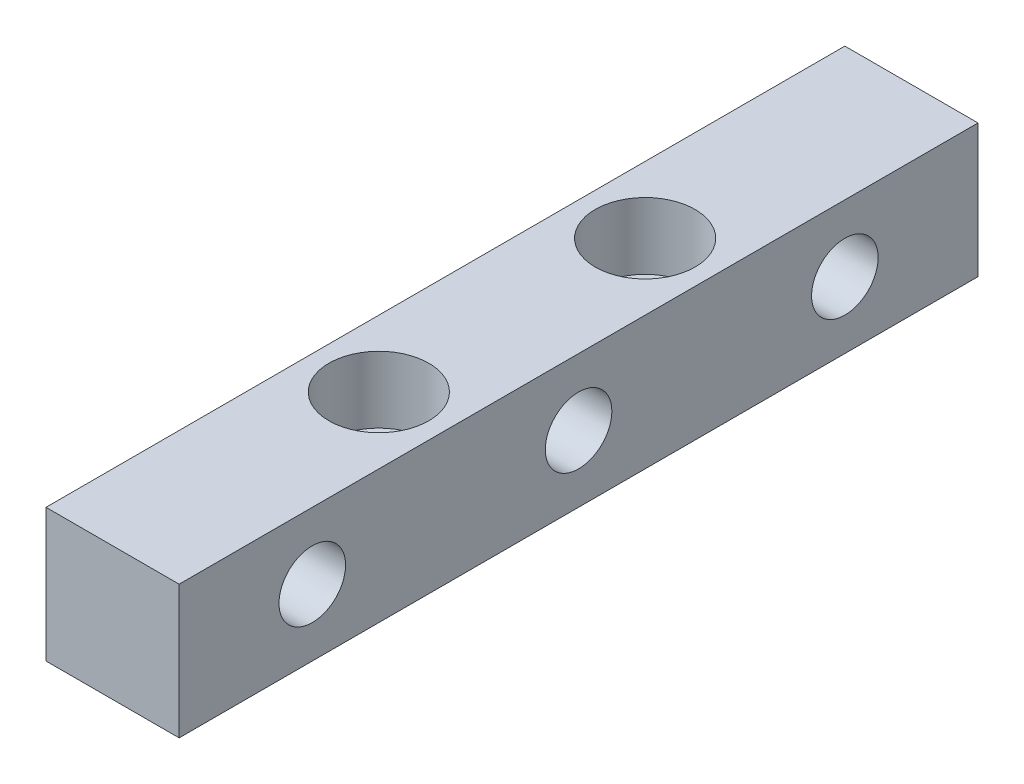
ISO-10303-21;
HEADER;
FILE_DESCRIPTION(('STEP AP214'),'2;1');
FILE_NAME('part.step','',(''),(''),'','','');
FILE_SCHEMA(('AUTOMOTIVE_DESIGN { 1 0 10303 214 1 1 1 1 }'));
ENDSEC;
DATA;
#1=APPLICATION_CONTEXT('core data for automotive mechanical design processes');
#2=APPLICATION_PROTOCOL_DEFINITION('international standard','automotive_design',2000,#1);
#3=PRODUCT_CONTEXT('',#1,'mechanical');
#4=PRODUCT('Part','Part','',(#3));
#5=PRODUCT_RELATED_PRODUCT_CATEGORY('part','',(#4));
#6=PRODUCT_DEFINITION_FORMATION('','',#4);
#7=PRODUCT_DEFINITION_CONTEXT('part definition',#1,'design');
#8=PRODUCT_DEFINITION('design','',#6,#7);
#9=PRODUCT_DEFINITION_SHAPE('','',#8);
#10=(LENGTH_UNIT() NAMED_UNIT(*) SI_UNIT(.MILLI.,.METRE.));
#11=(NAMED_UNIT(*) PLANE_ANGLE_UNIT() SI_UNIT($,.RADIAN.));
#12=(NAMED_UNIT(*) SI_UNIT($,.STERADIAN.) SOLID_ANGLE_UNIT());
#13=UNCERTAINTY_MEASURE_WITH_UNIT(LENGTH_MEASURE(1.E-05),#10,'distance_accuracy_value','');
#14=(GEOMETRIC_REPRESENTATION_CONTEXT(3) GLOBAL_UNCERTAINTY_ASSIGNED_CONTEXT((#13)) GLOBAL_UNIT_ASSIGNED_CONTEXT((#10,
#11,#12)) REPRESENTATION_CONTEXT('',''));
#15=CARTESIAN_POINT('',(0.,0.,0.));
#16=DIRECTION('',(0.,0.,1.));
#17=DIRECTION('',(1.,0.,0.));
#18=AXIS2_PLACEMENT_3D('',#15,#16,#17);
#19=CARTESIAN_POINT('',(-6.35000000000002,-6.35000000000006,38.1));
#20=DIRECTION('',(1.,0.,0.));
#21=DIRECTION('',(0.,0.,-1.));
#22=AXIS2_PLACEMENT_3D('',#19,#20,#21);
#23=PLANE('',#22);
#24=CARTESIAN_POINT('',(-6.35000000000005,0.,25.4));
#25=DIRECTION('',(1.,0.,0.));
#26=DIRECTION('',(0.,0.,-1.));
#27=AXIS2_PLACEMENT_3D('',#24,#25,#26);
#28=CIRCLE('',#27,3.17499999999999);
#29=CARTESIAN_POINT('',(-6.35000000000005,0.,22.225));
#30=VERTEX_POINT('',#29);
#31=EDGE_CURVE('E147',#30,#30,#28,.T.);
#32=ORIENTED_EDGE('',*,*,#31,.T.);
#33=EDGE_LOOP('',(#32));
#34=FACE_BOUND('',#33,.T.);
#35=CARTESIAN_POINT('',(-6.35000000000005,0.,0.));
#36=DIRECTION('',(1.,0.,0.));
#37=DIRECTION('',(0.,0.,-1.));
#38=AXIS2_PLACEMENT_3D('',#35,#36,#37);
#39=CIRCLE('',#38,3.17499999999999);
#40=CARTESIAN_POINT('',(-6.35000000000005,0.,-3.17499999999999));
#41=VERTEX_POINT('',#40);
#42=EDGE_CURVE('E141',#41,#41,#39,.T.);
#43=ORIENTED_EDGE('',*,*,#42,.T.);
#44=EDGE_LOOP('',(#43));
#45=FACE_BOUND('',#44,.T.);
#46=CARTESIAN_POINT('',(-6.35000000000005,0.,-25.4));
#47=DIRECTION('',(1.,0.,0.));
#48=DIRECTION('',(0.,0.,-1.));
#49=AXIS2_PLACEMENT_3D('',#46,#47,#48);
#50=CIRCLE('',#49,3.17499999999999);
#51=CARTESIAN_POINT('',(-6.35000000000005,0.,-28.575));
#52=VERTEX_POINT('',#51);
#53=EDGE_CURVE('E135',#52,#52,#50,.T.);
#54=ORIENTED_EDGE('',*,*,#53,.T.);
#55=EDGE_LOOP('',(#54));
#56=FACE_BOUND('',#55,.T.);
#57=DIRECTION('',(0.,-1.,0.));
#58=VECTOR('',#57,1.);
#59=CARTESIAN_POINT('',(-6.35000000000002,-6.35000000000006,-38.1));
#60=LINE('',#59,#58);
#61=CARTESIAN_POINT('',(-6.35000000000002,6.34999999999997,-38.1));
#62=VERTEX_POINT('',#61);
#63=CARTESIAN_POINT('',(-6.35000000000002,-6.35000000000006,-38.1));
#64=VERTEX_POINT('',#63);
#65=EDGE_CURVE('E98',#62,#64,#60,.T.);
#66=ORIENTED_EDGE('',*,*,#65,.T.);
#67=DIRECTION('',(0.,0.,-1.));
#68=VECTOR('',#67,1.);
#69=CARTESIAN_POINT('',(-6.35000000000002,-6.35000000000006,38.1));
#70=LINE('',#69,#68);
#71=CARTESIAN_POINT('',(-6.35000000000002,-6.35000000000006,38.1));
#72=VERTEX_POINT('',#71);
#73=EDGE_CURVE('E11',#72,#64,#70,.T.);
#74=ORIENTED_EDGE('',*,*,#73,.F.);
#75=DIRECTION('',(0.,-1.,0.));
#76=VECTOR('',#75,1.);
#77=CARTESIAN_POINT('',(-6.35000000000002,-6.35000000000006,38.1));
#78=LINE('',#77,#76);
#79=CARTESIAN_POINT('',(-6.35000000000002,6.34999999999997,38.1));
#80=VERTEX_POINT('',#79);
#81=EDGE_CURVE('E86',#80,#72,#78,.T.);
#82=ORIENTED_EDGE('',*,*,#81,.F.);
#83=DIRECTION('',(0.,0.,-1.));
#84=VECTOR('',#83,1.);
#85=CARTESIAN_POINT('',(-6.35000000000002,6.34999999999997,38.1));
#86=LINE('',#85,#84);
#87=EDGE_CURVE('E94',#80,#62,#86,.T.);
#88=ORIENTED_EDGE('',*,*,#87,.T.);
#89=EDGE_LOOP('',(#66,#74,#82,#88));
#90=FACE_BOUND('',#89,.T.);
#91=ADVANCED_FACE('F35',(#34,#45,#56,#90),#23,.F.);
#92=CARTESIAN_POINT('',(-6.35000000000002,-6.35000000000006,38.1));
#93=DIRECTION('',(0.,1.,0.));
#94=DIRECTION('',(0.,0.,1.));
#95=AXIS2_PLACEMENT_3D('',#92,#93,#94);
#96=PLANE('',#95);
#97=CARTESIAN_POINT('',(0.,-6.35000000000006,-12.7));
#98=DIRECTION('',(0.,1.,0.));
#99=DIRECTION('',(0.,0.,1.));
#100=AXIS2_PLACEMENT_3D('',#97,#98,#99);
#101=CIRCLE('',#100,3.175);
#102=CARTESIAN_POINT('',(0.,-6.35000000000006,-9.525));
#103=VERTEX_POINT('',#102);
#104=EDGE_CURVE('E123',#103,#103,#101,.T.);
#105=ORIENTED_EDGE('',*,*,#104,.T.);
#106=EDGE_LOOP('',(#105));
#107=FACE_BOUND('',#106,.T.);
#108=CARTESIAN_POINT('',(0.,-6.35000000000006,12.7));
#109=DIRECTION('',(0.,1.,0.));
#110=DIRECTION('',(0.,0.,1.));
#111=AXIS2_PLACEMENT_3D('',#108,#109,#110);
#112=CIRCLE('',#111,3.175);
#113=CARTESIAN_POINT('',(0.,-6.35000000000006,15.875));
#114=VERTEX_POINT('',#113);
#115=EDGE_CURVE('E101',#114,#114,#112,.T.);
#116=ORIENTED_EDGE('',*,*,#115,.T.);
#117=EDGE_LOOP('',(#116));
#118=FACE_BOUND('',#117,.T.);
#119=DIRECTION('',(1.,0.,0.));
#120=VECTOR('',#119,1.);
#121=CARTESIAN_POINT('',(-6.35000000000002,-6.35000000000006,-38.1));
#122=LINE('',#121,#120);
#123=CARTESIAN_POINT('',(6.34999999999997,-6.35000000000006,-38.1));
#124=VERTEX_POINT('',#123);
#125=EDGE_CURVE('E90',#64,#124,#122,.T.);
#126=ORIENTED_EDGE('',*,*,#125,.T.);
#127=DIRECTION('',(0.,0.,-1.));
#128=VECTOR('',#127,1.);
#129=CARTESIAN_POINT('',(6.34999999999997,-6.35000000000006,38.1));
#130=LINE('',#129,#128);
#131=CARTESIAN_POINT('',(6.34999999999997,-6.35000000000006,38.1));
#132=VERTEX_POINT('',#131);
#133=EDGE_CURVE('E43',#132,#124,#130,.T.);
#134=ORIENTED_EDGE('',*,*,#133,.F.);
#135=DIRECTION('',(1.,0.,0.));
#136=VECTOR('',#135,1.);
#137=CARTESIAN_POINT('',(-6.35000000000002,-6.35000000000006,38.1));
#138=LINE('',#137,#136);
#139=EDGE_CURVE('E81',#72,#132,#138,.T.);
#140=ORIENTED_EDGE('',*,*,#139,.F.);
#141=ORIENTED_EDGE('',*,*,#73,.T.);
#142=EDGE_LOOP('',(#126,#134,#140,#141));
#143=FACE_BOUND('',#142,.T.);
#144=ADVANCED_FACE('F89',(#107,#118,#143),#96,.F.);
#145=CARTESIAN_POINT('',(6.34999999999997,-6.35000000000006,38.1));
#146=DIRECTION('',(-1.,0.,0.));
#147=DIRECTION('',(0.,-1.,0.));
#148=AXIS2_PLACEMENT_3D('',#145,#146,#147);
#149=PLANE('',#148);
#150=CARTESIAN_POINT('',(6.35,0.,25.4));
#151=DIRECTION('',(1.,0.,0.));
#152=DIRECTION('',(0.,0.,-1.));
#153=AXIS2_PLACEMENT_3D('',#150,#151,#152);
#154=CIRCLE('',#153,3.17499999999999);
#155=CARTESIAN_POINT('',(6.35,0.,22.225));
#156=VERTEX_POINT('',#155);
#157=EDGE_CURVE('E150',#156,#156,#154,.T.);
#158=ORIENTED_EDGE('',*,*,#157,.F.);
#159=EDGE_LOOP('',(#158));
#160=FACE_BOUND('',#159,.T.);
#161=CARTESIAN_POINT('',(6.35,0.,0.));
#162=DIRECTION('',(1.,0.,0.));
#163=DIRECTION('',(0.,0.,-1.));
#164=AXIS2_PLACEMENT_3D('',#161,#162,#163);
#165=CIRCLE('',#164,3.17499999999999);
#166=CARTESIAN_POINT('',(6.35,0.,-3.17499999999999));
#167=VERTEX_POINT('',#166);
#168=EDGE_CURVE('E144',#167,#167,#165,.T.);
#169=ORIENTED_EDGE('',*,*,#168,.F.);
#170=EDGE_LOOP('',(#169));
#171=FACE_BOUND('',#170,.T.);
#172=CARTESIAN_POINT('',(6.35,0.,-25.4));
#173=DIRECTION('',(1.,0.,0.));
#174=DIRECTION('',(0.,0.,-1.));
#175=AXIS2_PLACEMENT_3D('',#172,#173,#174);
#176=CIRCLE('',#175,3.17499999999999);
#177=CARTESIAN_POINT('',(6.35,0.,-28.575));
#178=VERTEX_POINT('',#177);
#179=EDGE_CURVE('E138',#178,#178,#176,.T.);
#180=ORIENTED_EDGE('',*,*,#179,.F.);
#181=EDGE_LOOP('',(#180));
#182=FACE_BOUND('',#181,.T.);
#183=DIRECTION('',(0.,1.,0.));
#184=VECTOR('',#183,1.);
#185=CARTESIAN_POINT('',(6.34999999999997,-6.35000000000006,-38.1));
#186=LINE('',#185,#184);
#187=CARTESIAN_POINT('',(6.35000000000002,6.34999999999997,-38.1));
#188=VERTEX_POINT('',#187);
#189=EDGE_CURVE('E68',#124,#188,#186,.T.);
#190=ORIENTED_EDGE('',*,*,#189,.T.);
#191=DIRECTION('',(0.,0.,-1.));
#192=VECTOR('',#191,1.);
#193=CARTESIAN_POINT('',(6.35000000000002,6.34999999999997,38.1));
#194=LINE('',#193,#192);
#195=CARTESIAN_POINT('',(6.35000000000002,6.34999999999997,38.1));
#196=VERTEX_POINT('',#195);
#197=EDGE_CURVE('E91',#196,#188,#194,.T.);
#198=ORIENTED_EDGE('',*,*,#197,.F.);
#199=DIRECTION('',(0.,1.,0.));
#200=VECTOR('',#199,1.);
#201=CARTESIAN_POINT('',(6.34999999999997,-6.35000000000006,38.1));
#202=LINE('',#201,#200);
#203=EDGE_CURVE('E84',#132,#196,#202,.T.);
#204=ORIENTED_EDGE('',*,*,#203,.F.);
#205=ORIENTED_EDGE('',*,*,#133,.T.);
#206=EDGE_LOOP('',(#190,#198,#204,#205));
#207=FACE_BOUND('',#206,.T.);
#208=ADVANCED_FACE('F92',(#160,#171,#182,#207),#149,.F.);
#209=CARTESIAN_POINT('',(-6.35000000000002,6.34999999999997,38.1));
#210=DIRECTION('',(0.,-1.,0.));
#211=DIRECTION('',(0.,0.,-1.));
#212=AXIS2_PLACEMENT_3D('',#209,#210,#211);
#213=PLANE('',#212);
#214=CARTESIAN_POINT('',(0.,6.34999999999997,-12.7));
#215=DIRECTION('',(0.,1.,0.));
#216=DIRECTION('',(0.,0.,1.));
#217=AXIS2_PLACEMENT_3D('',#214,#215,#216);
#218=CIRCLE('',#217,4.7625);
#219=CARTESIAN_POINT('',(0.,6.34999999999997,-7.9375));
#220=VERTEX_POINT('',#219);
#221=EDGE_CURVE('E132',#220,#220,#218,.T.);
#222=ORIENTED_EDGE('',*,*,#221,.F.);
#223=EDGE_LOOP('',(#222));
#224=FACE_BOUND('',#223,.T.);
#225=CARTESIAN_POINT('',(0.,6.34999999999997,12.7));
#226=DIRECTION('',(0.,1.,0.));
#227=DIRECTION('',(0.,0.,1.));
#228=AXIS2_PLACEMENT_3D('',#225,#226,#227);
#229=CIRCLE('',#228,4.7625);
#230=CARTESIAN_POINT('',(0.,6.34999999999997,17.4625));
#231=VERTEX_POINT('',#230);
#232=EDGE_CURVE('E120',#231,#231,#229,.T.);
#233=ORIENTED_EDGE('',*,*,#232,.F.);
#234=EDGE_LOOP('',(#233));
#235=FACE_BOUND('',#234,.T.);
#236=DIRECTION('',(-1.,0.,0.));
#237=VECTOR('',#236,1.);
#238=CARTESIAN_POINT('',(-6.35000000000002,6.34999999999997,-38.1));
#239=LINE('',#238,#237);
#240=EDGE_CURVE('E74',#188,#62,#239,.T.);
#241=ORIENTED_EDGE('',*,*,#240,.T.);
#242=ORIENTED_EDGE('',*,*,#87,.F.);
#243=DIRECTION('',(-1.,0.,0.));
#244=VECTOR('',#243,1.);
#245=CARTESIAN_POINT('',(-6.35000000000002,6.34999999999997,38.1));
#246=LINE('',#245,#244);
#247=EDGE_CURVE('E51',#196,#80,#246,.T.);
#248=ORIENTED_EDGE('',*,*,#247,.F.);
#249=ORIENTED_EDGE('',*,*,#197,.T.);
#250=EDGE_LOOP('',(#241,#242,#248,#249));
#251=FACE_BOUND('',#250,.T.);
#252=ADVANCED_FACE('F106',(#224,#235,#251),#213,.F.);
#253=CARTESIAN_POINT('',(0.,0.,38.1));
#254=DIRECTION('',(0.,0.,-1.));
#255=DIRECTION('',(-1.,0.,0.));
#256=AXIS2_PLACEMENT_3D('',#253,#254,#255);
#257=PLANE('',#256);
#258=ORIENTED_EDGE('',*,*,#81,.T.);
#259=ORIENTED_EDGE('',*,*,#139,.T.);
#260=ORIENTED_EDGE('',*,*,#203,.T.);
#261=ORIENTED_EDGE('',*,*,#247,.T.);
#262=EDGE_LOOP('',(#258,#259,#260,#261));
#263=FACE_BOUND('',#262,.T.);
#264=ADVANCED_FACE('F82',(#263),#257,.F.);
#265=CARTESIAN_POINT('',(0.,0.,-38.1));
#266=DIRECTION('',(0.,0.,-1.));
#267=DIRECTION('',(-1.,0.,0.));
#268=AXIS2_PLACEMENT_3D('',#265,#266,#267);
#269=PLANE('',#268);
#270=ORIENTED_EDGE('',*,*,#65,.F.);
#271=ORIENTED_EDGE('',*,*,#240,.F.);
#272=ORIENTED_EDGE('',*,*,#189,.F.);
#273=ORIENTED_EDGE('',*,*,#125,.F.);
#274=EDGE_LOOP('',(#270,#271,#272,#273));
#275=FACE_BOUND('',#274,.T.);
#276=ADVANCED_FACE('F109',(#275),#269,.T.);
#277=CARTESIAN_POINT('',(0.,6.34999999999997,12.7));
#278=DIRECTION('',(0.,1.,0.));
#279=DIRECTION('',(0.,0.,1.));
#280=AXIS2_PLACEMENT_3D('',#277,#278,#279);
#281=CYLINDRICAL_SURFACE('',#280,3.175);
#282=ORIENTED_EDGE('',*,*,#115,.F.);
#283=EDGE_LOOP('',(#282));
#284=FACE_BOUND('',#283,.T.);
#285=CARTESIAN_POINT('',(0.,0.,12.7));
#286=DIRECTION('',(0.,1.,0.));
#287=DIRECTION('',(0.,0.,1.));
#288=AXIS2_PLACEMENT_3D('',#285,#286,#287);
#289=CIRCLE('',#288,3.175);
#290=CARTESIAN_POINT('',(0.,0.,15.875));
#291=VERTEX_POINT('',#290);
#292=EDGE_CURVE('E114',#291,#291,#289,.T.);
#293=ORIENTED_EDGE('',*,*,#292,.T.);
#294=EDGE_LOOP('',(#293));
#295=FACE_BOUND('',#294,.T.);
#296=ADVANCED_FACE('F261',(#284,#295),#281,.F.);
#297=CARTESIAN_POINT('',(3.175,0.,12.7));
#298=DIRECTION('',(0.,-1.,0.));
#299=DIRECTION('',(0.,0.,-1.));
#300=AXIS2_PLACEMENT_3D('',#297,#298,#299);
#301=PLANE('',#300);
#302=ORIENTED_EDGE('',*,*,#292,.F.);
#303=EDGE_LOOP('',(#302));
#304=FACE_BOUND('',#303,.T.);
#305=CARTESIAN_POINT('',(0.,0.,12.7));
#306=DIRECTION('',(0.,1.,0.));
#307=DIRECTION('',(0.,0.,1.));
#308=AXIS2_PLACEMENT_3D('',#305,#306,#307);
#309=CIRCLE('',#308,4.7625);
#310=CARTESIAN_POINT('',(0.,0.,17.4625));
#311=VERTEX_POINT('',#310);
#312=EDGE_CURVE('E117',#311,#311,#309,.T.);
#313=ORIENTED_EDGE('',*,*,#312,.T.);
#314=EDGE_LOOP('',(#313));
#315=FACE_BOUND('',#314,.T.);
#316=ADVANCED_FACE('F251',(#304,#315),#301,.F.);
#317=CARTESIAN_POINT('',(0.,6.34999999999997,12.7));
#318=DIRECTION('',(0.,1.,0.));
#319=DIRECTION('',(0.,0.,1.));
#320=AXIS2_PLACEMENT_3D('',#317,#318,#319);
#321=CYLINDRICAL_SURFACE('',#320,4.7625);
#322=ORIENTED_EDGE('',*,*,#312,.F.);
#323=EDGE_LOOP('',(#322));
#324=FACE_BOUND('',#323,.T.);
#325=ORIENTED_EDGE('',*,*,#232,.T.);
#326=EDGE_LOOP('',(#325));
#327=FACE_BOUND('',#326,.T.);
#328=ADVANCED_FACE('F241',(#324,#327),#321,.F.);
#329=CARTESIAN_POINT('',(0.,6.34999999999997,-12.7));
#330=DIRECTION('',(0.,1.,0.));
#331=DIRECTION('',(0.,0.,1.));
#332=AXIS2_PLACEMENT_3D('',#329,#330,#331);
#333=CYLINDRICAL_SURFACE('',#332,3.175);
#334=ORIENTED_EDGE('',*,*,#104,.F.);
#335=EDGE_LOOP('',(#334));
#336=FACE_BOUND('',#335,.T.);
#337=CARTESIAN_POINT('',(0.,0.,-12.7));
#338=DIRECTION('',(0.,1.,0.));
#339=DIRECTION('',(0.,0.,1.));
#340=AXIS2_PLACEMENT_3D('',#337,#338,#339);
#341=CIRCLE('',#340,3.175);
#342=CARTESIAN_POINT('',(0.,0.,-9.525));
#343=VERTEX_POINT('',#342);
#344=EDGE_CURVE('E126',#343,#343,#341,.T.);
#345=ORIENTED_EDGE('',*,*,#344,.T.);
#346=EDGE_LOOP('',(#345));
#347=FACE_BOUND('',#346,.T.);
#348=ADVANCED_FACE('F231',(#336,#347),#333,.F.);
#349=CARTESIAN_POINT('',(3.175,0.,-12.7));
#350=DIRECTION('',(0.,-1.,0.));
#351=DIRECTION('',(0.,0.,-1.));
#352=AXIS2_PLACEMENT_3D('',#349,#350,#351);
#353=PLANE('',#352);
#354=ORIENTED_EDGE('',*,*,#344,.F.);
#355=EDGE_LOOP('',(#354));
#356=FACE_BOUND('',#355,.T.);
#357=CARTESIAN_POINT('',(0.,0.,-12.7));
#358=DIRECTION('',(0.,1.,0.));
#359=DIRECTION('',(0.,0.,1.));
#360=AXIS2_PLACEMENT_3D('',#357,#358,#359);
#361=CIRCLE('',#360,4.7625);
#362=CARTESIAN_POINT('',(0.,0.,-7.9375));
#363=VERTEX_POINT('',#362);
#364=EDGE_CURVE('E129',#363,#363,#361,.T.);
#365=ORIENTED_EDGE('',*,*,#364,.T.);
#366=EDGE_LOOP('',(#365));
#367=FACE_BOUND('',#366,.T.);
#368=ADVANCED_FACE('F175',(#356,#367),#353,.F.);
#369=CARTESIAN_POINT('',(0.,6.34999999999997,-12.7));
#370=DIRECTION('',(0.,1.,0.));
#371=DIRECTION('',(0.,0.,1.));
#372=AXIS2_PLACEMENT_3D('',#369,#370,#371);
#373=CYLINDRICAL_SURFACE('',#372,4.7625);
#374=ORIENTED_EDGE('',*,*,#364,.F.);
#375=EDGE_LOOP('',(#374));
#376=FACE_BOUND('',#375,.T.);
#377=ORIENTED_EDGE('',*,*,#221,.T.);
#378=EDGE_LOOP('',(#377));
#379=FACE_BOUND('',#378,.T.);
#380=ADVANCED_FACE('F166',(#376,#379),#373,.F.);
#381=CARTESIAN_POINT('',(6.34999999999999,0.,-25.4));
#382=DIRECTION('',(1.,0.,0.));
#383=DIRECTION('',(0.,0.,-1.));
#384=AXIS2_PLACEMENT_3D('',#381,#382,#383);
#385=CYLINDRICAL_SURFACE('',#384,3.17499999999999);
#386=ORIENTED_EDGE('',*,*,#53,.F.);
#387=EDGE_LOOP('',(#386));
#388=FACE_BOUND('',#387,.T.);
#389=ORIENTED_EDGE('',*,*,#179,.T.);
#390=EDGE_LOOP('',(#389));
#391=FACE_BOUND('',#390,.T.);
#392=ADVANCED_FACE('F163',(#388,#391),#385,.F.);
#393=CARTESIAN_POINT('',(6.34999999999999,0.,0.));
#394=DIRECTION('',(1.,0.,0.));
#395=DIRECTION('',(0.,0.,-1.));
#396=AXIS2_PLACEMENT_3D('',#393,#394,#395);
#397=CYLINDRICAL_SURFACE('',#396,3.17499999999999);
#398=ORIENTED_EDGE('',*,*,#42,.F.);
#399=EDGE_LOOP('',(#398));
#400=FACE_BOUND('',#399,.T.);
#401=ORIENTED_EDGE('',*,*,#168,.T.);
#402=EDGE_LOOP('',(#401));
#403=FACE_BOUND('',#402,.T.);
#404=ADVANCED_FACE('F165',(#400,#403),#397,.F.);
#405=CARTESIAN_POINT('',(6.34999999999999,0.,25.4));
#406=DIRECTION('',(1.,0.,0.));
#407=DIRECTION('',(0.,0.,-1.));
#408=AXIS2_PLACEMENT_3D('',#405,#406,#407);
#409=CYLINDRICAL_SURFACE('',#408,3.17499999999999);
#410=ORIENTED_EDGE('',*,*,#31,.F.);
#411=EDGE_LOOP('',(#410));
#412=FACE_BOUND('',#411,.T.);
#413=ORIENTED_EDGE('',*,*,#157,.T.);
#414=EDGE_LOOP('',(#413));
#415=FACE_BOUND('',#414,.T.);
#416=ADVANCED_FACE('F154',(#412,#415),#409,.F.);
#417=CLOSED_SHELL('',(#91,#144,#208,#252,#264,#276,#296,#316,#328,#348,#368,#380,#392,#404,#416));
#418=MANIFOLD_SOLID_BREP('B2',#417);
#419=ADVANCED_BREP_SHAPE_REPRESENTATION('',(#18,#418),#14);
#420=SHAPE_DEFINITION_REPRESENTATION(#9,#419);
ENDSEC;
END-ISO-10303-21;
